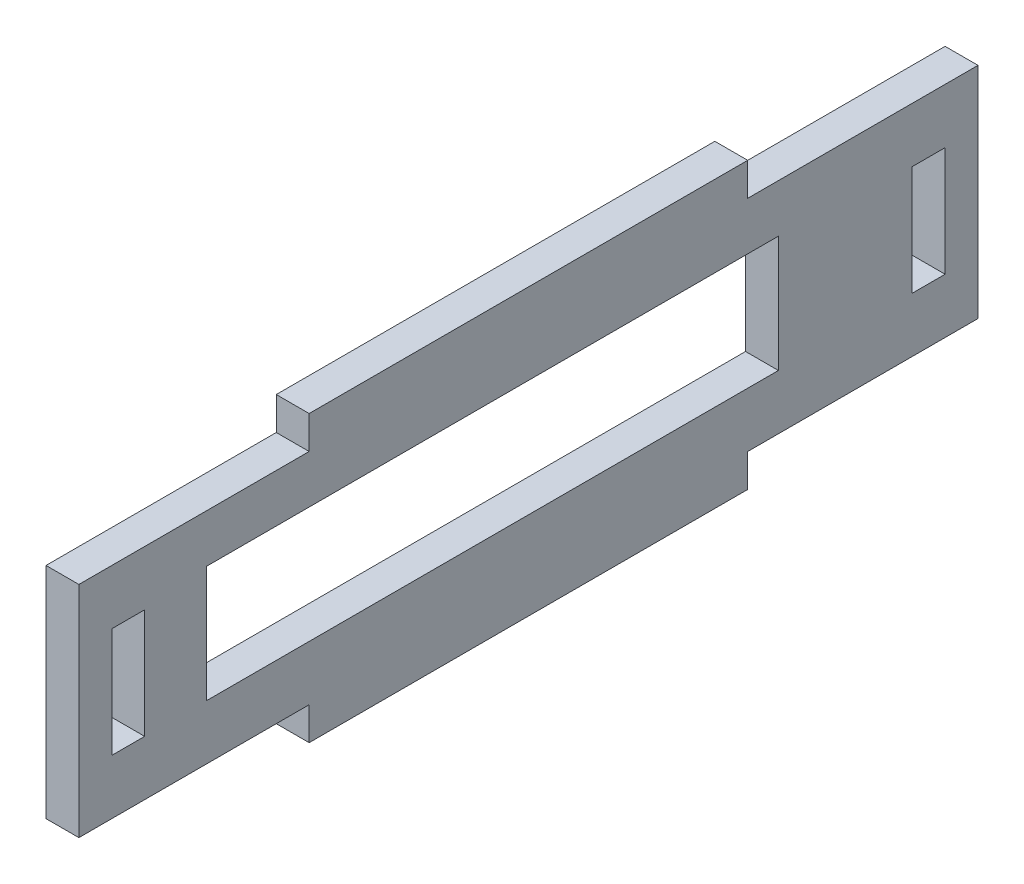
ISO-10303-21;
HEADER;
FILE_DESCRIPTION(('STEP AP214'),'2;1');
FILE_NAME('part.step','',(''),(''),'','','');
FILE_SCHEMA(('AUTOMOTIVE_DESIGN { 1 0 10303 214 1 1 1 1 }'));
ENDSEC;
DATA;
#1=APPLICATION_CONTEXT('core data for automotive mechanical design processes');
#2=APPLICATION_PROTOCOL_DEFINITION('international standard','automotive_design',2000,#1);
#3=PRODUCT_CONTEXT('',#1,'mechanical');
#4=PRODUCT('Part','Part','',(#3));
#5=PRODUCT_RELATED_PRODUCT_CATEGORY('part','',(#4));
#6=PRODUCT_DEFINITION_FORMATION('','',#4);
#7=PRODUCT_DEFINITION_CONTEXT('part definition',#1,'design');
#8=PRODUCT_DEFINITION('design','',#6,#7);
#9=PRODUCT_DEFINITION_SHAPE('','',#8);
#10=(LENGTH_UNIT() NAMED_UNIT(*) SI_UNIT(.MILLI.,.METRE.));
#11=(NAMED_UNIT(*) PLANE_ANGLE_UNIT() SI_UNIT($,.RADIAN.));
#12=(NAMED_UNIT(*) SI_UNIT($,.STERADIAN.) SOLID_ANGLE_UNIT());
#13=UNCERTAINTY_MEASURE_WITH_UNIT(LENGTH_MEASURE(1.E-05),#10,'distance_accuracy_value','');
#14=(GEOMETRIC_REPRESENTATION_CONTEXT(3) GLOBAL_UNCERTAINTY_ASSIGNED_CONTEXT((#13)) GLOBAL_UNIT_ASSIGNED_CONTEXT((#10,
#11,#12)) REPRESENTATION_CONTEXT('',''));
#15=CARTESIAN_POINT('',(0.,0.,0.));
#16=DIRECTION('',(0.,0.,1.));
#17=DIRECTION('',(1.,0.,0.));
#18=AXIS2_PLACEMENT_3D('',#15,#16,#17);
#19=CARTESIAN_POINT('',(3.,0.,0.));
#20=DIRECTION('',(-1.,0.,0.));
#21=DIRECTION('',(0.,0.,1.));
#22=AXIS2_PLACEMENT_3D('',#19,#20,#21);
#23=PLANE('',#22);
#24=DIRECTION('',(0.,-1.,0.));
#25=VECTOR('',#24,1.);
#26=CARTESIAN_POINT('',(3.,15.,-70.));
#27=LINE('',#26,#25);
#28=CARTESIAN_POINT('',(3.,15.,-70.));
#29=VERTEX_POINT('',#28);
#30=CARTESIAN_POINT('',(3.,5.,-70.));
#31=VERTEX_POINT('',#30);
#32=EDGE_CURVE('E230',#29,#31,#27,.T.);
#33=ORIENTED_EDGE('',*,*,#32,.F.);
#34=DIRECTION('',(0.,0.,1.));
#35=VECTOR('',#34,1.);
#36=CARTESIAN_POINT('',(3.,15.,-73.));
#37=LINE('',#36,#35);
#38=CARTESIAN_POINT('',(3.,15.,-73.));
#39=VERTEX_POINT('',#38);
#40=EDGE_CURVE('E238',#39,#29,#37,.T.);
#41=ORIENTED_EDGE('',*,*,#40,.F.);
#42=DIRECTION('',(0.,1.,0.));
#43=VECTOR('',#42,1.);
#44=CARTESIAN_POINT('',(3.,15.,-73.));
#45=LINE('',#44,#43);
#46=CARTESIAN_POINT('',(3.,5.,-73.));
#47=VERTEX_POINT('',#46);
#48=EDGE_CURVE('E235',#47,#39,#45,.T.);
#49=ORIENTED_EDGE('',*,*,#48,.F.);
#50=DIRECTION('',(0.,0.,-1.));
#51=VECTOR('',#50,1.);
#52=CARTESIAN_POINT('',(3.,5.,-73.));
#53=LINE('',#52,#51);
#54=EDGE_CURVE('E232',#31,#47,#53,.T.);
#55=ORIENTED_EDGE('',*,*,#54,.F.);
#56=EDGE_LOOP('',(#33,#41,#49,#55));
#57=FACE_BOUND('',#56,.T.);
#58=DIRECTION('',(0.,1.,0.));
#59=VECTOR('',#58,1.);
#60=CARTESIAN_POINT('',(3.,20.,-76.));
#61=LINE('',#60,#59);
#62=CARTESIAN_POINT('',(3.,0.,-76.));
#63=VERTEX_POINT('',#62);
#64=CARTESIAN_POINT('',(3.,20.,-76.));
#65=VERTEX_POINT('',#64);
#66=EDGE_CURVE('E292',#63,#65,#61,.T.);
#67=ORIENTED_EDGE('',*,*,#66,.T.);
#68=DIRECTION('',(0.,0.,1.));
#69=VECTOR('',#68,1.);
#70=CARTESIAN_POINT('',(3.,20.,-55.));
#71=LINE('',#70,#69);
#72=CARTESIAN_POINT('',(3.,20.,-55.));
#73=VERTEX_POINT('',#72);
#74=EDGE_CURVE('E295',#65,#73,#71,.T.);
#75=ORIENTED_EDGE('',*,*,#74,.T.);
#76=DIRECTION('',(0.,1.,0.));
#77=VECTOR('',#76,1.);
#78=CARTESIAN_POINT('',(3.,23.,-55.));
#79=LINE('',#78,#77);
#80=CARTESIAN_POINT('',(3.,23.,-55.));
#81=VERTEX_POINT('',#80);
#82=EDGE_CURVE('E298',#73,#81,#79,.T.);
#83=ORIENTED_EDGE('',*,*,#82,.T.);
#84=DIRECTION('',(0.,0.,1.));
#85=VECTOR('',#84,1.);
#86=CARTESIAN_POINT('',(3.,23.,-15.));
#87=LINE('',#86,#85);
#88=CARTESIAN_POINT('',(3.,23.,-15.));
#89=VERTEX_POINT('',#88);
#90=EDGE_CURVE('E300',#81,#89,#87,.T.);
#91=ORIENTED_EDGE('',*,*,#90,.T.);
#92=DIRECTION('',(0.,-1.,0.));
#93=VECTOR('',#92,1.);
#94=CARTESIAN_POINT('',(3.,20.,-15.));
#95=LINE('',#94,#93);
#96=CARTESIAN_POINT('',(3.,20.,-15.));
#97=VERTEX_POINT('',#96);
#98=EDGE_CURVE('E302',#89,#97,#95,.T.);
#99=ORIENTED_EDGE('',*,*,#98,.T.);
#100=DIRECTION('',(0.,0.,1.));
#101=VECTOR('',#100,1.);
#102=CARTESIAN_POINT('',(3.,20.,6.));
#103=LINE('',#102,#101);
#104=CARTESIAN_POINT('',(3.,20.,6.));
#105=VERTEX_POINT('',#104);
#106=EDGE_CURVE('E304',#97,#105,#103,.T.);
#107=ORIENTED_EDGE('',*,*,#106,.T.);
#108=DIRECTION('',(0.,-1.,0.));
#109=VECTOR('',#108,1.);
#110=CARTESIAN_POINT('',(3.,0.,6.));
#111=LINE('',#110,#109);
#112=CARTESIAN_POINT('',(3.,0.,6.));
#113=VERTEX_POINT('',#112);
#114=EDGE_CURVE('E306',#105,#113,#111,.T.);
#115=ORIENTED_EDGE('',*,*,#114,.T.);
#116=DIRECTION('',(0.,0.,-1.));
#117=VECTOR('',#116,1.);
#118=CARTESIAN_POINT('',(3.,0.,-15.));
#119=LINE('',#118,#117);
#120=CARTESIAN_POINT('',(3.,0.,-15.));
#121=VERTEX_POINT('',#120);
#122=EDGE_CURVE('E308',#113,#121,#119,.T.);
#123=ORIENTED_EDGE('',*,*,#122,.T.);
#124=DIRECTION('',(0.,-1.,0.));
#125=VECTOR('',#124,1.);
#126=CARTESIAN_POINT('',(3.,0.,-15.));
#127=LINE('',#126,#125);
#128=CARTESIAN_POINT('',(3.,-3.,-15.));
#129=VERTEX_POINT('',#128);
#130=EDGE_CURVE('E310',#121,#129,#127,.T.);
#131=ORIENTED_EDGE('',*,*,#130,.T.);
#132=DIRECTION('',(0.,0.,-1.));
#133=VECTOR('',#132,1.);
#134=CARTESIAN_POINT('',(3.,-3.,-55.));
#135=LINE('',#134,#133);
#136=CARTESIAN_POINT('',(3.,-3.,-55.));
#137=VERTEX_POINT('',#136);
#138=EDGE_CURVE('E312',#129,#137,#135,.T.);
#139=ORIENTED_EDGE('',*,*,#138,.T.);
#140=DIRECTION('',(0.,1.,0.));
#141=VECTOR('',#140,1.);
#142=CARTESIAN_POINT('',(3.,0.,-55.));
#143=LINE('',#142,#141);
#144=CARTESIAN_POINT('',(3.,0.,-55.));
#145=VERTEX_POINT('',#144);
#146=EDGE_CURVE('E314',#137,#145,#143,.T.);
#147=ORIENTED_EDGE('',*,*,#146,.T.);
#148=DIRECTION('',(0.,0.,-1.));
#149=VECTOR('',#148,1.);
#150=CARTESIAN_POINT('',(3.,0.,-76.));
#151=LINE('',#150,#149);
#152=EDGE_CURVE('E316',#145,#63,#151,.T.);
#153=ORIENTED_EDGE('',*,*,#152,.T.);
#154=EDGE_LOOP('',(#67,#75,#83,#91,#99,#107,#115,#123,#131,#139,#147,#153));
#155=FACE_BOUND('',#154,.T.);
#156=DIRECTION('',(0.,1.,0.));
#157=VECTOR('',#156,1.);
#158=CARTESIAN_POINT('',(3.,15.,0.));
#159=LINE('',#158,#157);
#160=CARTESIAN_POINT('',(3.,5.,0.));
#161=VERTEX_POINT('',#160);
#162=CARTESIAN_POINT('',(3.,15.,0.));
#163=VERTEX_POINT('',#162);
#164=EDGE_CURVE('E261',#161,#163,#159,.T.);
#165=ORIENTED_EDGE('',*,*,#164,.F.);
#166=DIRECTION('',(0.,0.,-1.));
#167=VECTOR('',#166,1.);
#168=CARTESIAN_POINT('',(3.,5.,3.));
#169=LINE('',#168,#167);
#170=CARTESIAN_POINT('',(3.,5.,3.));
#171=VERTEX_POINT('',#170);
#172=EDGE_CURVE('E269',#171,#161,#169,.T.);
#173=ORIENTED_EDGE('',*,*,#172,.F.);
#174=DIRECTION('',(0.,-1.,0.));
#175=VECTOR('',#174,1.);
#176=CARTESIAN_POINT('',(3.,15.,3.));
#177=LINE('',#176,#175);
#178=CARTESIAN_POINT('',(3.,15.,3.));
#179=VERTEX_POINT('',#178);
#180=EDGE_CURVE('E266',#179,#171,#177,.T.);
#181=ORIENTED_EDGE('',*,*,#180,.F.);
#182=DIRECTION('',(0.,0.,1.));
#183=VECTOR('',#182,1.);
#184=CARTESIAN_POINT('',(3.,15.,3.));
#185=LINE('',#184,#183);
#186=EDGE_CURVE('E263',#163,#179,#185,.T.);
#187=ORIENTED_EDGE('',*,*,#186,.F.);
#188=EDGE_LOOP('',(#165,#173,#181,#187));
#189=FACE_BOUND('',#188,.T.);
#190=DIRECTION('',(0.,-1.,0.));
#191=VECTOR('',#190,1.);
#192=CARTESIAN_POINT('',(3.,15.6108985002201,-5.62138678028228));
#193=LINE('',#192,#191);
#194=CARTESIAN_POINT('',(3.,15.6108985002201,-5.62138678028228));
#195=VERTEX_POINT('',#194);
#196=CARTESIAN_POINT('',(3.,5.,-5.62138678028228));
#197=VERTEX_POINT('',#196);
#198=EDGE_CURVE('E194',#195,#197,#193,.T.);
#199=ORIENTED_EDGE('',*,*,#198,.F.);
#200=DIRECTION('',(0.,0.,1.));
#201=VECTOR('',#200,1.);
#202=CARTESIAN_POINT('',(3.,15.6108985002201,-5.62138678028228));
#203=LINE('',#202,#201);
#204=CARTESIAN_POINT('',(3.,15.6108985002201,-57.7987041688935));
#205=VERTEX_POINT('',#204);
#206=EDGE_CURVE('E216',#205,#195,#203,.T.);
#207=ORIENTED_EDGE('',*,*,#206,.F.);
#208=DIRECTION('',(0.,1.,0.));
#209=VECTOR('',#208,1.);
#210=CARTESIAN_POINT('',(3.,15.6108985002201,-57.7987041688935));
#211=LINE('',#210,#209);
#212=CARTESIAN_POINT('',(3.,5.,-57.7987041688935));
#213=VERTEX_POINT('',#212);
#214=EDGE_CURVE('E214',#213,#205,#211,.T.);
#215=ORIENTED_EDGE('',*,*,#214,.F.);
#216=DIRECTION('',(0.,0.,-1.));
#217=VECTOR('',#216,1.);
#218=CARTESIAN_POINT('',(3.,5.,-5.62138678028228));
#219=LINE('',#218,#217);
#220=EDGE_CURVE('E202',#197,#213,#219,.T.);
#221=ORIENTED_EDGE('',*,*,#220,.F.);
#222=EDGE_LOOP('',(#199,#207,#215,#221));
#223=FACE_BOUND('',#222,.T.);
#224=ADVANCED_FACE('F33',(#57,#155,#189,#223),#23,.F.);
#225=CARTESIAN_POINT('',(0.,0.,0.));
#226=DIRECTION('',(-1.,0.,0.));
#227=DIRECTION('',(0.,0.,1.));
#228=AXIS2_PLACEMENT_3D('',#225,#226,#227);
#229=PLANE('',#228);
#230=DIRECTION('',(0.,1.,0.));
#231=VECTOR('',#230,1.);
#232=CARTESIAN_POINT('',(0.,20.,-76.));
#233=LINE('',#232,#231);
#234=CARTESIAN_POINT('',(0.,0.,-76.));
#235=VERTEX_POINT('',#234);
#236=CARTESIAN_POINT('',(0.,20.,-76.));
#237=VERTEX_POINT('',#236);
#238=EDGE_CURVE('E291',#235,#237,#233,.T.);
#239=ORIENTED_EDGE('',*,*,#238,.F.);
#240=DIRECTION('',(0.,0.,-1.));
#241=VECTOR('',#240,1.);
#242=CARTESIAN_POINT('',(0.,0.,-76.));
#243=LINE('',#242,#241);
#244=CARTESIAN_POINT('',(0.,0.,-55.));
#245=VERTEX_POINT('',#244);
#246=EDGE_CURVE('E296',#245,#235,#243,.T.);
#247=ORIENTED_EDGE('',*,*,#246,.F.);
#248=DIRECTION('',(0.,1.,0.));
#249=VECTOR('',#248,1.);
#250=CARTESIAN_POINT('',(0.,0.,-55.));
#251=LINE('',#250,#249);
#252=CARTESIAN_POINT('',(0.,-3.,-55.));
#253=VERTEX_POINT('',#252);
#254=EDGE_CURVE('E339',#253,#245,#251,.T.);
#255=ORIENTED_EDGE('',*,*,#254,.F.);
#256=DIRECTION('',(0.,0.,-1.));
#257=VECTOR('',#256,1.);
#258=CARTESIAN_POINT('',(0.,-3.,-55.));
#259=LINE('',#258,#257);
#260=CARTESIAN_POINT('',(0.,-3.,-15.));
#261=VERTEX_POINT('',#260);
#262=EDGE_CURVE('E337',#261,#253,#259,.T.);
#263=ORIENTED_EDGE('',*,*,#262,.F.);
#264=DIRECTION('',(0.,-1.,0.));
#265=VECTOR('',#264,1.);
#266=CARTESIAN_POINT('',(0.,0.,-15.));
#267=LINE('',#266,#265);
#268=CARTESIAN_POINT('',(0.,0.,-15.));
#269=VERTEX_POINT('',#268);
#270=EDGE_CURVE('E335',#269,#261,#267,.T.);
#271=ORIENTED_EDGE('',*,*,#270,.F.);
#272=DIRECTION('',(0.,0.,-1.));
#273=VECTOR('',#272,1.);
#274=CARTESIAN_POINT('',(0.,0.,-15.));
#275=LINE('',#274,#273);
#276=CARTESIAN_POINT('',(0.,0.,6.));
#277=VERTEX_POINT('',#276);
#278=EDGE_CURVE('E333',#277,#269,#275,.T.);
#279=ORIENTED_EDGE('',*,*,#278,.F.);
#280=DIRECTION('',(0.,-1.,0.));
#281=VECTOR('',#280,1.);
#282=CARTESIAN_POINT('',(0.,0.,6.));
#283=LINE('',#282,#281);
#284=CARTESIAN_POINT('',(0.,20.,6.));
#285=VERTEX_POINT('',#284);
#286=EDGE_CURVE('E331',#285,#277,#283,.T.);
#287=ORIENTED_EDGE('',*,*,#286,.F.);
#288=DIRECTION('',(0.,0.,1.));
#289=VECTOR('',#288,1.);
#290=CARTESIAN_POINT('',(0.,20.,6.));
#291=LINE('',#290,#289);
#292=CARTESIAN_POINT('',(0.,20.,-15.));
#293=VERTEX_POINT('',#292);
#294=EDGE_CURVE('E329',#293,#285,#291,.T.);
#295=ORIENTED_EDGE('',*,*,#294,.F.);
#296=DIRECTION('',(0.,-1.,0.));
#297=VECTOR('',#296,1.);
#298=CARTESIAN_POINT('',(0.,20.,-15.));
#299=LINE('',#298,#297);
#300=CARTESIAN_POINT('',(0.,23.,-15.));
#301=VERTEX_POINT('',#300);
#302=EDGE_CURVE('E327',#301,#293,#299,.T.);
#303=ORIENTED_EDGE('',*,*,#302,.F.);
#304=DIRECTION('',(0.,0.,1.));
#305=VECTOR('',#304,1.);
#306=CARTESIAN_POINT('',(0.,23.,-15.));
#307=LINE('',#306,#305);
#308=CARTESIAN_POINT('',(0.,23.,-55.));
#309=VERTEX_POINT('',#308);
#310=EDGE_CURVE('E325',#309,#301,#307,.T.);
#311=ORIENTED_EDGE('',*,*,#310,.F.);
#312=DIRECTION('',(0.,1.,0.));
#313=VECTOR('',#312,1.);
#314=CARTESIAN_POINT('',(0.,23.,-55.));
#315=LINE('',#314,#313);
#316=CARTESIAN_POINT('',(0.,20.,-55.));
#317=VERTEX_POINT('',#316);
#318=EDGE_CURVE('E323',#317,#309,#315,.T.);
#319=ORIENTED_EDGE('',*,*,#318,.F.);
#320=DIRECTION('',(0.,0.,1.));
#321=VECTOR('',#320,1.);
#322=CARTESIAN_POINT('',(0.,20.,-55.));
#323=LINE('',#322,#321);
#324=EDGE_CURVE('E321',#237,#317,#323,.T.);
#325=ORIENTED_EDGE('',*,*,#324,.F.);
#326=EDGE_LOOP('',(#239,#247,#255,#263,#271,#279,#287,#295,#303,#311,#319,#325));
#327=FACE_BOUND('',#326,.T.);
#328=DIRECTION('',(0.,0.,-1.));
#329=VECTOR('',#328,1.);
#330=CARTESIAN_POINT('',(0.,5.,3.));
#331=LINE('',#330,#329);
#332=CARTESIAN_POINT('',(0.,5.,3.));
#333=VERTEX_POINT('',#332);
#334=CARTESIAN_POINT('',(0.,5.,0.));
#335=VERTEX_POINT('',#334);
#336=EDGE_CURVE('E264',#333,#335,#331,.T.);
#337=ORIENTED_EDGE('',*,*,#336,.T.);
#338=DIRECTION('',(0.,1.,0.));
#339=VECTOR('',#338,1.);
#340=CARTESIAN_POINT('',(0.,15.,0.));
#341=LINE('',#340,#339);
#342=CARTESIAN_POINT('',(0.,15.,0.));
#343=VERTEX_POINT('',#342);
#344=EDGE_CURVE('E260',#335,#343,#341,.T.);
#345=ORIENTED_EDGE('',*,*,#344,.T.);
#346=DIRECTION('',(0.,0.,1.));
#347=VECTOR('',#346,1.);
#348=CARTESIAN_POINT('',(0.,15.,3.));
#349=LINE('',#348,#347);
#350=CARTESIAN_POINT('',(0.,15.,3.));
#351=VERTEX_POINT('',#350);
#352=EDGE_CURVE('E274',#343,#351,#349,.T.);
#353=ORIENTED_EDGE('',*,*,#352,.T.);
#354=DIRECTION('',(0.,-1.,0.));
#355=VECTOR('',#354,1.);
#356=CARTESIAN_POINT('',(0.,15.,3.));
#357=LINE('',#356,#355);
#358=EDGE_CURVE('E277',#351,#333,#357,.T.);
#359=ORIENTED_EDGE('',*,*,#358,.T.);
#360=EDGE_LOOP('',(#337,#345,#353,#359));
#361=FACE_BOUND('',#360,.T.);
#362=DIRECTION('',(0.,0.,1.));
#363=VECTOR('',#362,1.);
#364=CARTESIAN_POINT('',(0.,15.,-73.));
#365=LINE('',#364,#363);
#366=CARTESIAN_POINT('',(0.,15.,-73.));
#367=VERTEX_POINT('',#366);
#368=CARTESIAN_POINT('',(0.,15.,-70.));
#369=VERTEX_POINT('',#368);
#370=EDGE_CURVE('E233',#367,#369,#365,.T.);
#371=ORIENTED_EDGE('',*,*,#370,.T.);
#372=DIRECTION('',(0.,-1.,0.));
#373=VECTOR('',#372,1.);
#374=CARTESIAN_POINT('',(0.,15.,-70.));
#375=LINE('',#374,#373);
#376=CARTESIAN_POINT('',(0.,5.,-70.));
#377=VERTEX_POINT('',#376);
#378=EDGE_CURVE('E210',#369,#377,#375,.T.);
#379=ORIENTED_EDGE('',*,*,#378,.T.);
#380=DIRECTION('',(0.,0.,-1.));
#381=VECTOR('',#380,1.);
#382=CARTESIAN_POINT('',(0.,5.,-73.));
#383=LINE('',#382,#381);
#384=CARTESIAN_POINT('',(0.,5.,-73.));
#385=VERTEX_POINT('',#384);
#386=EDGE_CURVE('E243',#377,#385,#383,.T.);
#387=ORIENTED_EDGE('',*,*,#386,.T.);
#388=DIRECTION('',(0.,1.,0.));
#389=VECTOR('',#388,1.);
#390=CARTESIAN_POINT('',(0.,15.,-73.));
#391=LINE('',#390,#389);
#392=EDGE_CURVE('E246',#385,#367,#391,.T.);
#393=ORIENTED_EDGE('',*,*,#392,.T.);
#394=EDGE_LOOP('',(#371,#379,#387,#393));
#395=FACE_BOUND('',#394,.T.);
#396=DIRECTION('',(0.,0.,1.));
#397=VECTOR('',#396,1.);
#398=CARTESIAN_POINT('',(0.,15.6108985002201,-5.62138678028228));
#399=LINE('',#398,#397);
#400=CARTESIAN_POINT('',(0.,15.6108985002201,-57.7987041688935));
#401=VERTEX_POINT('',#400);
#402=CARTESIAN_POINT('',(0.,15.6108985002201,-5.62138678028228));
#403=VERTEX_POINT('',#402);
#404=EDGE_CURVE('E203',#401,#403,#399,.T.);
#405=ORIENTED_EDGE('',*,*,#404,.T.);
#406=DIRECTION('',(0.,-1.,0.));
#407=VECTOR('',#406,1.);
#408=CARTESIAN_POINT('',(0.,15.6108985002201,-5.62138678028228));
#409=LINE('',#408,#407);
#410=CARTESIAN_POINT('',(0.,5.,-5.62138678028228));
#411=VERTEX_POINT('',#410);
#412=EDGE_CURVE('E56',#403,#411,#409,.T.);
#413=ORIENTED_EDGE('',*,*,#412,.T.);
#414=DIRECTION('',(0.,0.,-1.));
#415=VECTOR('',#414,1.);
#416=CARTESIAN_POINT('',(0.,5.,-5.62138678028228));
#417=LINE('',#416,#415);
#418=CARTESIAN_POINT('',(0.,5.,-57.7987041688935));
#419=VERTEX_POINT('',#418);
#420=EDGE_CURVE('E209',#411,#419,#417,.T.);
#421=ORIENTED_EDGE('',*,*,#420,.T.);
#422=DIRECTION('',(0.,1.,0.));
#423=VECTOR('',#422,1.);
#424=CARTESIAN_POINT('',(0.,15.6108985002201,-57.7987041688935));
#425=LINE('',#424,#423);
#426=EDGE_CURVE('E222',#419,#401,#425,.T.);
#427=ORIENTED_EDGE('',*,*,#426,.T.);
#428=EDGE_LOOP('',(#405,#413,#421,#427));
#429=FACE_BOUND('',#428,.T.);
#430=ADVANCED_FACE('F381',(#327,#361,#395,#429),#229,.T.);
#431=CARTESIAN_POINT('',(3.,20.,-76.));
#432=DIRECTION('',(0.,0.,1.));
#433=DIRECTION('',(1.,0.,0.));
#434=AXIS2_PLACEMENT_3D('',#431,#432,#433);
#435=PLANE('',#434);
#436=ORIENTED_EDGE('',*,*,#238,.T.);
#437=DIRECTION('',(-1.,0.,0.));
#438=VECTOR('',#437,1.);
#439=CARTESIAN_POINT('',(3.,20.,-76.));
#440=LINE('',#439,#438);
#441=EDGE_CURVE('E11',#65,#237,#440,.T.);
#442=ORIENTED_EDGE('',*,*,#441,.F.);
#443=ORIENTED_EDGE('',*,*,#66,.F.);
#444=DIRECTION('',(-1.,0.,0.));
#445=VECTOR('',#444,1.);
#446=CARTESIAN_POINT('',(3.,0.,-76.));
#447=LINE('',#446,#445);
#448=EDGE_CURVE('E318',#63,#235,#447,.T.);
#449=ORIENTED_EDGE('',*,*,#448,.T.);
#450=EDGE_LOOP('',(#436,#442,#443,#449));
#451=FACE_BOUND('',#450,.T.);
#452=ADVANCED_FACE('F35',(#451),#435,.F.);
#453=CARTESIAN_POINT('',(3.,20.,-55.));
#454=DIRECTION('',(0.,-1.,0.));
#455=DIRECTION('',(0.,0.,-1.));
#456=AXIS2_PLACEMENT_3D('',#453,#454,#455);
#457=PLANE('',#456);
#458=ORIENTED_EDGE('',*,*,#324,.T.);
#459=DIRECTION('',(-1.,0.,0.));
#460=VECTOR('',#459,1.);
#461=CARTESIAN_POINT('',(3.,20.,-55.));
#462=LINE('',#461,#460);
#463=EDGE_CURVE('E41',#73,#317,#462,.T.);
#464=ORIENTED_EDGE('',*,*,#463,.F.);
#465=ORIENTED_EDGE('',*,*,#74,.F.);
#466=ORIENTED_EDGE('',*,*,#441,.T.);
#467=EDGE_LOOP('',(#458,#464,#465,#466));
#468=FACE_BOUND('',#467,.T.);
#469=ADVANCED_FACE('F399',(#468),#457,.F.);
#470=CARTESIAN_POINT('',(3.,23.,-55.));
#471=DIRECTION('',(0.,0.,1.));
#472=DIRECTION('',(1.,0.,0.));
#473=AXIS2_PLACEMENT_3D('',#470,#471,#472);
#474=PLANE('',#473);
#475=ORIENTED_EDGE('',*,*,#318,.T.);
#476=DIRECTION('',(-1.,0.,0.));
#477=VECTOR('',#476,1.);
#478=CARTESIAN_POINT('',(3.,23.,-55.));
#479=LINE('',#478,#477);
#480=EDGE_CURVE('E368',#81,#309,#479,.T.);
#481=ORIENTED_EDGE('',*,*,#480,.F.);
#482=ORIENTED_EDGE('',*,*,#82,.F.);
#483=ORIENTED_EDGE('',*,*,#463,.T.);
#484=EDGE_LOOP('',(#475,#481,#482,#483));
#485=FACE_BOUND('',#484,.T.);
#486=ADVANCED_FACE('F375',(#485),#474,.F.);
#487=CARTESIAN_POINT('',(3.,23.,-15.));
#488=DIRECTION('',(0.,-1.,0.));
#489=DIRECTION('',(0.,0.,-1.));
#490=AXIS2_PLACEMENT_3D('',#487,#488,#489);
#491=PLANE('',#490);
#492=ORIENTED_EDGE('',*,*,#310,.T.);
#493=DIRECTION('',(-1.,0.,0.));
#494=VECTOR('',#493,1.);
#495=CARTESIAN_POINT('',(3.,23.,-15.));
#496=LINE('',#495,#494);
#497=EDGE_CURVE('E365',#89,#301,#496,.T.);
#498=ORIENTED_EDGE('',*,*,#497,.F.);
#499=ORIENTED_EDGE('',*,*,#90,.F.);
#500=ORIENTED_EDGE('',*,*,#480,.T.);
#501=EDGE_LOOP('',(#492,#498,#499,#500));
#502=FACE_BOUND('',#501,.T.);
#503=ADVANCED_FACE('F387',(#502),#491,.F.);
#504=CARTESIAN_POINT('',(3.,20.,-15.));
#505=DIRECTION('',(0.,0.,-1.));
#506=DIRECTION('',(-1.,0.,0.));
#507=AXIS2_PLACEMENT_3D('',#504,#505,#506);
#508=PLANE('',#507);
#509=ORIENTED_EDGE('',*,*,#302,.T.);
#510=DIRECTION('',(-1.,0.,0.));
#511=VECTOR('',#510,1.);
#512=CARTESIAN_POINT('',(3.,20.,-15.));
#513=LINE('',#512,#511);
#514=EDGE_CURVE('E362',#97,#293,#513,.T.);
#515=ORIENTED_EDGE('',*,*,#514,.F.);
#516=ORIENTED_EDGE('',*,*,#98,.F.);
#517=ORIENTED_EDGE('',*,*,#497,.T.);
#518=EDGE_LOOP('',(#509,#515,#516,#517));
#519=FACE_BOUND('',#518,.T.);
#520=ADVANCED_FACE('F391',(#519),#508,.F.);
#521=CARTESIAN_POINT('',(3.,20.,6.));
#522=DIRECTION('',(0.,-1.,0.));
#523=DIRECTION('',(0.,0.,-1.));
#524=AXIS2_PLACEMENT_3D('',#521,#522,#523);
#525=PLANE('',#524);
#526=ORIENTED_EDGE('',*,*,#294,.T.);
#527=DIRECTION('',(-1.,0.,0.));
#528=VECTOR('',#527,1.);
#529=CARTESIAN_POINT('',(3.,20.,6.));
#530=LINE('',#529,#528);
#531=EDGE_CURVE('E359',#105,#285,#530,.T.);
#532=ORIENTED_EDGE('',*,*,#531,.F.);
#533=ORIENTED_EDGE('',*,*,#106,.F.);
#534=ORIENTED_EDGE('',*,*,#514,.T.);
#535=EDGE_LOOP('',(#526,#532,#533,#534));
#536=FACE_BOUND('',#535,.T.);
#537=ADVANCED_FACE('F432',(#536),#525,.F.);
#538=CARTESIAN_POINT('',(3.,0.,6.));
#539=DIRECTION('',(0.,0.,-1.));
#540=DIRECTION('',(-1.,0.,0.));
#541=AXIS2_PLACEMENT_3D('',#538,#539,#540);
#542=PLANE('',#541);
#543=ORIENTED_EDGE('',*,*,#286,.T.);
#544=DIRECTION('',(-1.,0.,0.));
#545=VECTOR('',#544,1.);
#546=CARTESIAN_POINT('',(3.,0.,6.));
#547=LINE('',#546,#545);
#548=EDGE_CURVE('E356',#113,#277,#547,.T.);
#549=ORIENTED_EDGE('',*,*,#548,.F.);
#550=ORIENTED_EDGE('',*,*,#114,.F.);
#551=ORIENTED_EDGE('',*,*,#531,.T.);
#552=EDGE_LOOP('',(#543,#549,#550,#551));
#553=FACE_BOUND('',#552,.T.);
#554=ADVANCED_FACE('F430',(#553),#542,.F.);
#555=CARTESIAN_POINT('',(3.,0.,-15.));
#556=DIRECTION('',(0.,1.,0.));
#557=DIRECTION('',(0.,0.,1.));
#558=AXIS2_PLACEMENT_3D('',#555,#556,#557);
#559=PLANE('',#558);
#560=ORIENTED_EDGE('',*,*,#278,.T.);
#561=DIRECTION('',(-1.,0.,0.));
#562=VECTOR('',#561,1.);
#563=CARTESIAN_POINT('',(3.,0.,-15.));
#564=LINE('',#563,#562);
#565=EDGE_CURVE('E353',#121,#269,#564,.T.);
#566=ORIENTED_EDGE('',*,*,#565,.F.);
#567=ORIENTED_EDGE('',*,*,#122,.F.);
#568=ORIENTED_EDGE('',*,*,#548,.T.);
#569=EDGE_LOOP('',(#560,#566,#567,#568));
#570=FACE_BOUND('',#569,.T.);
#571=ADVANCED_FACE('F426',(#570),#559,.F.);
#572=CARTESIAN_POINT('',(3.,0.,-15.));
#573=DIRECTION('',(0.,0.,-1.));
#574=DIRECTION('',(-1.,0.,0.));
#575=AXIS2_PLACEMENT_3D('',#572,#573,#574);
#576=PLANE('',#575);
#577=ORIENTED_EDGE('',*,*,#270,.T.);
#578=DIRECTION('',(-1.,0.,0.));
#579=VECTOR('',#578,1.);
#580=CARTESIAN_POINT('',(3.,-3.,-15.));
#581=LINE('',#580,#579);
#582=EDGE_CURVE('E350',#129,#261,#581,.T.);
#583=ORIENTED_EDGE('',*,*,#582,.F.);
#584=ORIENTED_EDGE('',*,*,#130,.F.);
#585=ORIENTED_EDGE('',*,*,#565,.T.);
#586=EDGE_LOOP('',(#577,#583,#584,#585));
#587=FACE_BOUND('',#586,.T.);
#588=ADVANCED_FACE('F421',(#587),#576,.F.);
#589=CARTESIAN_POINT('',(3.,-3.,-55.));
#590=DIRECTION('',(0.,1.,0.));
#591=DIRECTION('',(0.,0.,1.));
#592=AXIS2_PLACEMENT_3D('',#589,#590,#591);
#593=PLANE('',#592);
#594=ORIENTED_EDGE('',*,*,#262,.T.);
#595=DIRECTION('',(-1.,0.,0.));
#596=VECTOR('',#595,1.);
#597=CARTESIAN_POINT('',(3.,-3.,-55.));
#598=LINE('',#597,#596);
#599=EDGE_CURVE('E347',#137,#253,#598,.T.);
#600=ORIENTED_EDGE('',*,*,#599,.F.);
#601=ORIENTED_EDGE('',*,*,#138,.F.);
#602=ORIENTED_EDGE('',*,*,#582,.T.);
#603=EDGE_LOOP('',(#594,#600,#601,#602));
#604=FACE_BOUND('',#603,.T.);
#605=ADVANCED_FACE('F415',(#604),#593,.F.);
#606=CARTESIAN_POINT('',(3.,0.,-55.));
#607=DIRECTION('',(0.,0.,1.));
#608=DIRECTION('',(1.,0.,0.));
#609=AXIS2_PLACEMENT_3D('',#606,#607,#608);
#610=PLANE('',#609);
#611=ORIENTED_EDGE('',*,*,#254,.T.);
#612=DIRECTION('',(-1.,0.,0.));
#613=VECTOR('',#612,1.);
#614=CARTESIAN_POINT('',(3.,0.,-55.));
#615=LINE('',#614,#613);
#616=EDGE_CURVE('E344',#145,#245,#615,.T.);
#617=ORIENTED_EDGE('',*,*,#616,.F.);
#618=ORIENTED_EDGE('',*,*,#146,.F.);
#619=ORIENTED_EDGE('',*,*,#599,.T.);
#620=EDGE_LOOP('',(#611,#617,#618,#619));
#621=FACE_BOUND('',#620,.T.);
#622=ADVANCED_FACE('F411',(#621),#610,.F.);
#623=CARTESIAN_POINT('',(3.,0.,-76.));
#624=DIRECTION('',(0.,1.,0.));
#625=DIRECTION('',(0.,0.,1.));
#626=AXIS2_PLACEMENT_3D('',#623,#624,#625);
#627=PLANE('',#626);
#628=ORIENTED_EDGE('',*,*,#246,.T.);
#629=ORIENTED_EDGE('',*,*,#448,.F.);
#630=ORIENTED_EDGE('',*,*,#152,.F.);
#631=ORIENTED_EDGE('',*,*,#616,.T.);
#632=EDGE_LOOP('',(#628,#629,#630,#631));
#633=FACE_BOUND('',#632,.T.);
#634=ADVANCED_FACE('F406',(#633),#627,.F.);
#635=CARTESIAN_POINT('',(3.,15.,0.));
#636=DIRECTION('',(0.,0.,1.));
#637=DIRECTION('',(0.,-1.,0.));
#638=AXIS2_PLACEMENT_3D('',#635,#636,#637);
#639=PLANE('',#638);
#640=ORIENTED_EDGE('',*,*,#344,.F.);
#641=DIRECTION('',(-1.,0.,0.));
#642=VECTOR('',#641,1.);
#643=CARTESIAN_POINT('',(3.,5.,0.));
#644=LINE('',#643,#642);
#645=EDGE_CURVE('E271',#161,#335,#644,.T.);
#646=ORIENTED_EDGE('',*,*,#645,.F.);
#647=ORIENTED_EDGE('',*,*,#164,.T.);
#648=DIRECTION('',(-1.,0.,0.));
#649=VECTOR('',#648,1.);
#650=CARTESIAN_POINT('',(3.,15.,0.));
#651=LINE('',#650,#649);
#652=EDGE_CURVE('E288',#163,#343,#651,.T.);
#653=ORIENTED_EDGE('',*,*,#652,.T.);
#654=EDGE_LOOP('',(#640,#646,#647,#653));
#655=FACE_BOUND('',#654,.T.);
#656=ADVANCED_FACE('F450',(#655),#639,.T.);
#657=CARTESIAN_POINT('',(3.,15.,3.));
#658=DIRECTION('',(0.,-1.,0.));
#659=DIRECTION('',(0.,0.,-1.));
#660=AXIS2_PLACEMENT_3D('',#657,#658,#659);
#661=PLANE('',#660);
#662=ORIENTED_EDGE('',*,*,#352,.F.);
#663=ORIENTED_EDGE('',*,*,#652,.F.);
#664=ORIENTED_EDGE('',*,*,#186,.T.);
#665=DIRECTION('',(-1.,0.,0.));
#666=VECTOR('',#665,1.);
#667=CARTESIAN_POINT('',(3.,15.,3.));
#668=LINE('',#667,#666);
#669=EDGE_CURVE('E286',#179,#351,#668,.T.);
#670=ORIENTED_EDGE('',*,*,#669,.T.);
#671=EDGE_LOOP('',(#662,#663,#664,#670));
#672=FACE_BOUND('',#671,.T.);
#673=ADVANCED_FACE('F488',(#672),#661,.T.);
#674=CARTESIAN_POINT('',(3.,15.,3.));
#675=DIRECTION('',(0.,0.,-1.));
#676=DIRECTION('',(0.,1.,0.));
#677=AXIS2_PLACEMENT_3D('',#674,#675,#676);
#678=PLANE('',#677);
#679=ORIENTED_EDGE('',*,*,#358,.F.);
#680=ORIENTED_EDGE('',*,*,#669,.F.);
#681=ORIENTED_EDGE('',*,*,#180,.T.);
#682=DIRECTION('',(-1.,0.,0.));
#683=VECTOR('',#682,1.);
#684=CARTESIAN_POINT('',(3.,5.,3.));
#685=LINE('',#684,#683);
#686=EDGE_CURVE('E284',#171,#333,#685,.T.);
#687=ORIENTED_EDGE('',*,*,#686,.T.);
#688=EDGE_LOOP('',(#679,#680,#681,#687));
#689=FACE_BOUND('',#688,.T.);
#690=ADVANCED_FACE('F495',(#689),#678,.T.);
#691=CARTESIAN_POINT('',(3.,5.,3.));
#692=DIRECTION('',(0.,1.,0.));
#693=DIRECTION('',(0.,0.,1.));
#694=AXIS2_PLACEMENT_3D('',#691,#692,#693);
#695=PLANE('',#694);
#696=ORIENTED_EDGE('',*,*,#336,.F.);
#697=ORIENTED_EDGE('',*,*,#686,.F.);
#698=ORIENTED_EDGE('',*,*,#172,.T.);
#699=ORIENTED_EDGE('',*,*,#645,.T.);
#700=EDGE_LOOP('',(#696,#697,#698,#699));
#701=FACE_BOUND('',#700,.T.);
#702=ADVANCED_FACE('F502',(#701),#695,.T.);
#703=CARTESIAN_POINT('',(3.,15.,-70.));
#704=DIRECTION('',(0.,0.,-1.));
#705=DIRECTION('',(-1.,0.,0.));
#706=AXIS2_PLACEMENT_3D('',#703,#704,#705);
#707=PLANE('',#706);
#708=ORIENTED_EDGE('',*,*,#378,.F.);
#709=DIRECTION('',(-1.,0.,0.));
#710=VECTOR('',#709,1.);
#711=CARTESIAN_POINT('',(3.,15.,-70.));
#712=LINE('',#711,#710);
#713=EDGE_CURVE('E240',#29,#369,#712,.T.);
#714=ORIENTED_EDGE('',*,*,#713,.F.);
#715=ORIENTED_EDGE('',*,*,#32,.T.);
#716=DIRECTION('',(-1.,0.,0.));
#717=VECTOR('',#716,1.);
#718=CARTESIAN_POINT('',(3.,5.,-70.));
#719=LINE('',#718,#717);
#720=EDGE_CURVE('E257',#31,#377,#719,.T.);
#721=ORIENTED_EDGE('',*,*,#720,.T.);
#722=EDGE_LOOP('',(#708,#714,#715,#721));
#723=FACE_BOUND('',#722,.T.);
#724=ADVANCED_FACE('F510',(#723),#707,.T.);
#725=CARTESIAN_POINT('',(3.,5.,-73.));
#726=DIRECTION('',(0.,1.,0.));
#727=DIRECTION('',(0.,0.,1.));
#728=AXIS2_PLACEMENT_3D('',#725,#726,#727);
#729=PLANE('',#728);
#730=ORIENTED_EDGE('',*,*,#386,.F.);
#731=ORIENTED_EDGE('',*,*,#720,.F.);
#732=ORIENTED_EDGE('',*,*,#54,.T.);
#733=DIRECTION('',(-1.,0.,0.));
#734=VECTOR('',#733,1.);
#735=CARTESIAN_POINT('',(3.,5.,-73.));
#736=LINE('',#735,#734);
#737=EDGE_CURVE('E255',#47,#385,#736,.T.);
#738=ORIENTED_EDGE('',*,*,#737,.T.);
#739=EDGE_LOOP('',(#730,#731,#732,#738));
#740=FACE_BOUND('',#739,.T.);
#741=ADVANCED_FACE('F518',(#740),#729,.T.);
#742=CARTESIAN_POINT('',(3.,15.,-73.));
#743=DIRECTION('',(0.,0.,1.));
#744=DIRECTION('',(1.,0.,0.));
#745=AXIS2_PLACEMENT_3D('',#742,#743,#744);
#746=PLANE('',#745);
#747=ORIENTED_EDGE('',*,*,#392,.F.);
#748=ORIENTED_EDGE('',*,*,#737,.F.);
#749=ORIENTED_EDGE('',*,*,#48,.T.);
#750=DIRECTION('',(-1.,0.,0.));
#751=VECTOR('',#750,1.);
#752=CARTESIAN_POINT('',(3.,15.,-73.));
#753=LINE('',#752,#751);
#754=EDGE_CURVE('E253',#39,#367,#753,.T.);
#755=ORIENTED_EDGE('',*,*,#754,.T.);
#756=EDGE_LOOP('',(#747,#748,#749,#755));
#757=FACE_BOUND('',#756,.T.);
#758=ADVANCED_FACE('F526',(#757),#746,.T.);
#759=CARTESIAN_POINT('',(3.,15.,-73.));
#760=DIRECTION('',(0.,-1.,0.));
#761=DIRECTION('',(0.,0.,-1.));
#762=AXIS2_PLACEMENT_3D('',#759,#760,#761);
#763=PLANE('',#762);
#764=ORIENTED_EDGE('',*,*,#370,.F.);
#765=ORIENTED_EDGE('',*,*,#754,.F.);
#766=ORIENTED_EDGE('',*,*,#40,.T.);
#767=ORIENTED_EDGE('',*,*,#713,.T.);
#768=EDGE_LOOP('',(#764,#765,#766,#767));
#769=FACE_BOUND('',#768,.T.);
#770=ADVANCED_FACE('F534',(#769),#763,.T.);
#771=CARTESIAN_POINT('',(3.,15.6108985002201,-5.62138678028228));
#772=DIRECTION('',(0.,0.,-1.));
#773=DIRECTION('',(-1.,0.,0.));
#774=AXIS2_PLACEMENT_3D('',#771,#772,#773);
#775=PLANE('',#774);
#776=ORIENTED_EDGE('',*,*,#412,.F.);
#777=DIRECTION('',(-1.,0.,0.));
#778=VECTOR('',#777,1.);
#779=CARTESIAN_POINT('',(3.,15.6108985002201,-5.62138678028228));
#780=LINE('',#779,#778);
#781=EDGE_CURVE('E198',#195,#403,#780,.T.);
#782=ORIENTED_EDGE('',*,*,#781,.F.);
#783=ORIENTED_EDGE('',*,*,#198,.T.);
#784=DIRECTION('',(-1.,0.,0.));
#785=VECTOR('',#784,1.);
#786=CARTESIAN_POINT('',(3.,5.,-5.62138678028228));
#787=LINE('',#786,#785);
#788=EDGE_CURVE('E197',#197,#411,#787,.T.);
#789=ORIENTED_EDGE('',*,*,#788,.T.);
#790=EDGE_LOOP('',(#776,#782,#783,#789));
#791=FACE_BOUND('',#790,.T.);
#792=ADVANCED_FACE('F196',(#791),#775,.T.);
#793=CARTESIAN_POINT('',(3.,5.,-5.62138678028228));
#794=DIRECTION('',(0.,1.,0.));
#795=DIRECTION('',(0.,0.,1.));
#796=AXIS2_PLACEMENT_3D('',#793,#794,#795);
#797=PLANE('',#796);
#798=ORIENTED_EDGE('',*,*,#420,.F.);
#799=ORIENTED_EDGE('',*,*,#788,.F.);
#800=ORIENTED_EDGE('',*,*,#220,.T.);
#801=DIRECTION('',(-1.,0.,0.));
#802=VECTOR('',#801,1.);
#803=CARTESIAN_POINT('',(3.,5.,-57.7987041688935));
#804=LINE('',#803,#802);
#805=EDGE_CURVE('E211',#213,#419,#804,.T.);
#806=ORIENTED_EDGE('',*,*,#805,.T.);
#807=EDGE_LOOP('',(#798,#799,#800,#806));
#808=FACE_BOUND('',#807,.T.);
#809=ADVANCED_FACE('F206',(#808),#797,.T.);
#810=CARTESIAN_POINT('',(3.,15.6108985002201,-57.7987041688935));
#811=DIRECTION('',(0.,0.,1.));
#812=DIRECTION('',(1.,0.,0.));
#813=AXIS2_PLACEMENT_3D('',#810,#811,#812);
#814=PLANE('',#813);
#815=ORIENTED_EDGE('',*,*,#426,.F.);
#816=ORIENTED_EDGE('',*,*,#805,.F.);
#817=ORIENTED_EDGE('',*,*,#214,.T.);
#818=DIRECTION('',(-1.,0.,0.));
#819=VECTOR('',#818,1.);
#820=CARTESIAN_POINT('',(3.,15.6108985002201,-57.7987041688935));
#821=LINE('',#820,#819);
#822=EDGE_CURVE('E48',#205,#401,#821,.T.);
#823=ORIENTED_EDGE('',*,*,#822,.T.);
#824=EDGE_LOOP('',(#815,#816,#817,#823));
#825=FACE_BOUND('',#824,.T.);
#826=ADVANCED_FACE('F555',(#825),#814,.T.);
#827=CARTESIAN_POINT('',(3.,15.6108985002201,-5.62138678028228));
#828=DIRECTION('',(0.,-1.,0.));
#829=DIRECTION('',(0.,0.,-1.));
#830=AXIS2_PLACEMENT_3D('',#827,#828,#829);
#831=PLANE('',#830);
#832=ORIENTED_EDGE('',*,*,#404,.F.);
#833=ORIENTED_EDGE('',*,*,#822,.F.);
#834=ORIENTED_EDGE('',*,*,#206,.T.);
#835=ORIENTED_EDGE('',*,*,#781,.T.);
#836=EDGE_LOOP('',(#832,#833,#834,#835));
#837=FACE_BOUND('',#836,.T.);
#838=ADVANCED_FACE('F562',(#837),#831,.T.);
#839=CLOSED_SHELL('',(#224,#430,#452,#469,#486,#503,#520,#537,#554,#571,#588,#605,#622,#634,
#656,#673,#690,#702,#724,#741,#758,#770,#792,#809,#826,#838));
#840=MANIFOLD_SOLID_BREP('B2',#839);
#841=ADVANCED_BREP_SHAPE_REPRESENTATION('',(#18,#840),#14);
#842=SHAPE_DEFINITION_REPRESENTATION(#9,#841);
ENDSEC;
END-ISO-10303-21;
